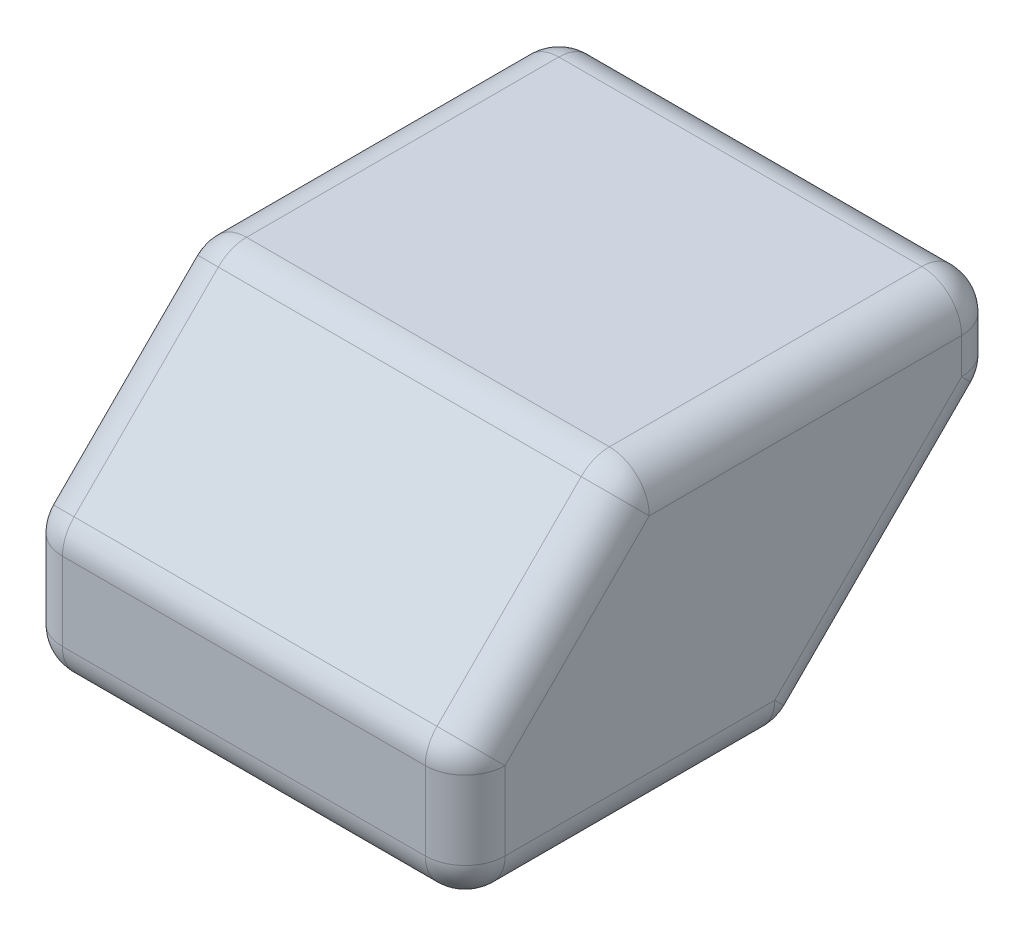
ISO-10303-21;
HEADER;
FILE_DESCRIPTION(('STEP AP214'),'2;1');
FILE_NAME('part.step','',(''),(''),'','','');
FILE_SCHEMA(('AUTOMOTIVE_DESIGN { 1 0 10303 214 1 1 1 1 }'));
ENDSEC;
DATA;
#1=APPLICATION_CONTEXT('core data for automotive mechanical design processes');
#2=APPLICATION_PROTOCOL_DEFINITION('international standard','automotive_design',2000,#1);
#3=PRODUCT_CONTEXT('',#1,'mechanical');
#4=PRODUCT('Part','Part','',(#3));
#5=PRODUCT_RELATED_PRODUCT_CATEGORY('part','',(#4));
#6=PRODUCT_DEFINITION_FORMATION('','',#4);
#7=PRODUCT_DEFINITION_CONTEXT('part definition',#1,'design');
#8=PRODUCT_DEFINITION('design','',#6,#7);
#9=PRODUCT_DEFINITION_SHAPE('','',#8);
#10=(LENGTH_UNIT() NAMED_UNIT(*) SI_UNIT(.MILLI.,.METRE.));
#11=(NAMED_UNIT(*) PLANE_ANGLE_UNIT() SI_UNIT($,.RADIAN.));
#12=(NAMED_UNIT(*) SI_UNIT($,.STERADIAN.) SOLID_ANGLE_UNIT());
#13=UNCERTAINTY_MEASURE_WITH_UNIT(LENGTH_MEASURE(1.E-05),#10,'distance_accuracy_value','');
#14=(GEOMETRIC_REPRESENTATION_CONTEXT(3) GLOBAL_UNCERTAINTY_ASSIGNED_CONTEXT((#13)) GLOBAL_UNIT_ASSIGNED_CONTEXT((#10,
#11,#12)) REPRESENTATION_CONTEXT('',''));
#15=CARTESIAN_POINT('',(0.,0.,0.));
#16=DIRECTION('',(0.,0.,1.));
#17=DIRECTION('',(1.,0.,0.));
#18=AXIS2_PLACEMENT_3D('',#15,#16,#17);
#19=CARTESIAN_POINT('',(0.,18.034,0.));
#20=DIRECTION('',(1.,0.,0.));
#21=DIRECTION('',(0.,0.,-1.));
#22=AXIS2_PLACEMENT_3D('',#19,#20,#21);
#23=PLANE('',#22);
#24=DIRECTION('',(0.,0.,1.));
#25=VECTOR('',#24,1.);
#26=CARTESIAN_POINT('',(0.,15.654,0.));
#27=LINE('',#26,#25);
#28=CARTESIAN_POINT('',(0.,15.654,-10.985828278448));
#29=VERTEX_POINT('',#28);
#30=CARTESIAN_POINT('',(0.,15.654,-29.624));
#31=VERTEX_POINT('',#30);
#32=EDGE_CURVE('E204',#29,#31,#27,.F.);
#33=ORIENTED_EDGE('',*,*,#32,.T.);
#34=DIRECTION('',(0.,-1.,0.));
#35=VECTOR('',#34,1.);
#36=CARTESIAN_POINT('',(0.,18.034,-29.624));
#37=LINE('',#36,#35);
#38=CARTESIAN_POINT('',(0.,13.525828278448,-29.624));
#39=VERTEX_POINT('',#38);
#40=EDGE_CURVE('E166',#31,#39,#37,.T.);
#41=ORIENTED_EDGE('',*,*,#40,.T.);
#42=DIRECTION('',(0.,-0.707106781186546,0.707106781186549));
#43=VECTOR('',#42,1.);
#44=CARTESIAN_POINT('',(0.,1.68291413922399,-17.781085860776));
#45=LINE('',#44,#43);
#46=CARTESIAN_POINT('',(0.,2.38,-18.478171721552));
#47=VERTEX_POINT('',#46);
#48=EDGE_CURVE('E160',#39,#47,#45,.T.);
#49=ORIENTED_EDGE('',*,*,#48,.T.);
#50=DIRECTION('',(0.,0.,1.));
#51=VECTOR('',#50,1.);
#52=CARTESIAN_POINT('',(0.,2.38,0.));
#53=LINE('',#52,#51);
#54=CARTESIAN_POINT('',(0.,2.38,-2.38));
#55=VERTEX_POINT('',#54);
#56=EDGE_CURVE('E163',#47,#55,#53,.T.);
#57=ORIENTED_EDGE('',*,*,#56,.T.);
#58=DIRECTION('',(0.,-1.,0.));
#59=VECTOR('',#58,1.);
#60=CARTESIAN_POINT('',(0.,18.034,-2.38));
#61=LINE('',#60,#59);
#62=CARTESIAN_POINT('',(0.,7.04817172155201,-2.38));
#63=VERTEX_POINT('',#62);
#64=EDGE_CURVE('E171',#55,#63,#61,.F.);
#65=ORIENTED_EDGE('',*,*,#64,.T.);
#66=DIRECTION('',(0.,-0.707106781186549,0.707106781186546));
#67=VECTOR('',#66,1.);
#68=CARTESIAN_POINT('',(0.,16.351085860776,-11.682914139224));
#69=LINE('',#68,#67);
#70=EDGE_CURVE('E170',#63,#29,#69,.F.);
#71=ORIENTED_EDGE('',*,*,#70,.T.);
#72=EDGE_LOOP('',(#33,#41,#49,#57,#65,#71));
#73=FACE_BOUND('',#72,.T.);
#74=ADVANCED_FACE('F34',(#73),#23,.F.);
#75=CARTESIAN_POINT('',(0.,18.034,0.));
#76=DIRECTION('',(0.,0.,-1.));
#77=DIRECTION('',(-1.,0.,0.));
#78=AXIS2_PLACEMENT_3D('',#75,#76,#77);
#79=PLANE('',#78);
#80=DIRECTION('',(0.,-1.,0.));
#81=VECTOR('',#80,1.);
#82=CARTESIAN_POINT('',(24.036,18.034,0.));
#83=LINE('',#82,#81);
#84=CARTESIAN_POINT('',(24.036,2.38,0.));
#85=VERTEX_POINT('',#84);
#86=CARTESIAN_POINT('',(24.036,7.04817172155201,0.));
#87=VERTEX_POINT('',#86);
#88=EDGE_CURVE('E218',#85,#87,#83,.F.);
#89=ORIENTED_EDGE('',*,*,#88,.T.);
#90=DIRECTION('',(1.,0.,0.));
#91=VECTOR('',#90,1.);
#92=CARTESIAN_POINT('',(0.,7.04817172155201,0.));
#93=LINE('',#92,#91);
#94=CARTESIAN_POINT('',(2.38,7.04817172155201,0.));
#95=VERTEX_POINT('',#94);
#96=EDGE_CURVE('E222',#87,#95,#93,.F.);
#97=ORIENTED_EDGE('',*,*,#96,.T.);
#98=DIRECTION('',(0.,-1.,0.));
#99=VECTOR('',#98,1.);
#100=CARTESIAN_POINT('',(2.38,18.034,0.));
#101=LINE('',#100,#99);
#102=CARTESIAN_POINT('',(2.38,2.38,0.));
#103=VERTEX_POINT('',#102);
#104=EDGE_CURVE('E220',#95,#103,#101,.T.);
#105=ORIENTED_EDGE('',*,*,#104,.T.);
#106=DIRECTION('',(1.,0.,0.));
#107=VECTOR('',#106,1.);
#108=CARTESIAN_POINT('',(26.416,2.38,0.));
#109=LINE('',#108,#107);
#110=EDGE_CURVE('E216',#103,#85,#109,.T.);
#111=ORIENTED_EDGE('',*,*,#110,.T.);
#112=EDGE_LOOP('',(#89,#97,#105,#111));
#113=FACE_BOUND('',#112,.T.);
#114=ADVANCED_FACE('F435',(#113),#79,.F.);
#115=CARTESIAN_POINT('',(26.416,18.034,0.));
#116=DIRECTION('',(-1.,0.,0.));
#117=DIRECTION('',(0.,0.,1.));
#118=AXIS2_PLACEMENT_3D('',#115,#116,#117);
#119=PLANE('',#118);
#120=DIRECTION('',(0.,0.707106781186546,-0.707106781186549));
#121=VECTOR('',#120,1.);
#122=CARTESIAN_POINT('',(26.416,14.222914139224,-30.321085860776));
#123=LINE('',#122,#121);
#124=CARTESIAN_POINT('',(26.416,2.38,-18.478171721552));
#125=VERTEX_POINT('',#124);
#126=CARTESIAN_POINT('',(26.416,13.525828278448,-29.624));
#127=VERTEX_POINT('',#126);
#128=EDGE_CURVE('E229',#125,#127,#123,.T.);
#129=ORIENTED_EDGE('',*,*,#128,.T.);
#130=DIRECTION('',(0.,-1.,0.));
#131=VECTOR('',#130,1.);
#132=CARTESIAN_POINT('',(26.416,18.034,-29.624));
#133=LINE('',#132,#131);
#134=CARTESIAN_POINT('',(26.416,15.654,-29.624));
#135=VERTEX_POINT('',#134);
#136=EDGE_CURVE('E236',#127,#135,#133,.F.);
#137=ORIENTED_EDGE('',*,*,#136,.T.);
#138=DIRECTION('',(0.,0.,-1.));
#139=VECTOR('',#138,1.);
#140=CARTESIAN_POINT('',(26.416,15.654,0.));
#141=LINE('',#140,#139);
#142=CARTESIAN_POINT('',(26.416,15.654,-10.985828278448));
#143=VERTEX_POINT('',#142);
#144=EDGE_CURVE('E234',#135,#143,#141,.F.);
#145=ORIENTED_EDGE('',*,*,#144,.T.);
#146=DIRECTION('',(0.,0.707106781186549,-0.707106781186546));
#147=VECTOR('',#146,1.);
#148=CARTESIAN_POINT('',(26.416,6.35108586077599,-1.68291413922399));
#149=LINE('',#148,#147);
#150=CARTESIAN_POINT('',(26.416,7.04817172155201,-2.38));
#151=VERTEX_POINT('',#150);
#152=EDGE_CURVE('E231',#143,#151,#149,.F.);
#153=ORIENTED_EDGE('',*,*,#152,.T.);
#154=DIRECTION('',(0.,-1.,0.));
#155=VECTOR('',#154,1.);
#156=CARTESIAN_POINT('',(26.416,18.034,-2.38));
#157=LINE('',#156,#155);
#158=CARTESIAN_POINT('',(26.416,2.38,-2.38));
#159=VERTEX_POINT('',#158);
#160=EDGE_CURVE('E227',#151,#159,#157,.T.);
#161=ORIENTED_EDGE('',*,*,#160,.T.);
#162=DIRECTION('',(0.,0.,-1.));
#163=VECTOR('',#162,1.);
#164=CARTESIAN_POINT('',(26.416,2.38,-19.464));
#165=LINE('',#164,#163);
#166=EDGE_CURVE('E225',#159,#125,#165,.T.);
#167=ORIENTED_EDGE('',*,*,#166,.T.);
#168=EDGE_LOOP('',(#129,#137,#145,#153,#161,#167));
#169=FACE_BOUND('',#168,.T.);
#170=ADVANCED_FACE('F403',(#169),#119,.F.);
#171=CARTESIAN_POINT('',(0.,18.034,-32.004));
#172=DIRECTION('',(0.,0.,1.));
#173=DIRECTION('',(1.,0.,0.));
#174=AXIS2_PLACEMENT_3D('',#171,#172,#173);
#175=PLANE('',#174);
#176=DIRECTION('',(0.,-1.,0.));
#177=VECTOR('',#176,1.);
#178=CARTESIAN_POINT('',(24.036,18.034,-32.004));
#179=LINE('',#178,#177);
#180=CARTESIAN_POINT('',(24.036,15.654,-32.004));
#181=VERTEX_POINT('',#180);
#182=CARTESIAN_POINT('',(24.036,13.525828278448,-32.004));
#183=VERTEX_POINT('',#182);
#184=EDGE_CURVE('E43',#181,#183,#179,.T.);
#185=ORIENTED_EDGE('',*,*,#184,.T.);
#186=DIRECTION('',(-1.,0.,0.));
#187=VECTOR('',#186,1.);
#188=CARTESIAN_POINT('',(0.,13.525828278448,-32.004));
#189=LINE('',#188,#187);
#190=CARTESIAN_POINT('',(2.38,13.525828278448,-32.004));
#191=VERTEX_POINT('',#190);
#192=EDGE_CURVE('E11',#183,#191,#189,.T.);
#193=ORIENTED_EDGE('',*,*,#192,.T.);
#194=DIRECTION('',(0.,-1.,0.));
#195=VECTOR('',#194,1.);
#196=CARTESIAN_POINT('',(2.38,18.034,-32.004));
#197=LINE('',#196,#195);
#198=CARTESIAN_POINT('',(2.38,15.654,-32.004));
#199=VERTEX_POINT('',#198);
#200=EDGE_CURVE('E57',#191,#199,#197,.F.);
#201=ORIENTED_EDGE('',*,*,#200,.T.);
#202=DIRECTION('',(-1.,0.,0.));
#203=VECTOR('',#202,1.);
#204=CARTESIAN_POINT('',(0.,15.654,-32.004));
#205=LINE('',#204,#203);
#206=EDGE_CURVE('E264',#199,#181,#205,.F.);
#207=ORIENTED_EDGE('',*,*,#206,.T.);
#208=EDGE_LOOP('',(#185,#193,#201,#207));
#209=FACE_BOUND('',#208,.T.);
#210=ADVANCED_FACE('F363',(#209),#175,.F.);
#211=CARTESIAN_POINT('',(0.,18.034,0.));
#212=DIRECTION('',(0.,-1.,0.));
#213=DIRECTION('',(0.,0.,-1.));
#214=AXIS2_PLACEMENT_3D('',#211,#212,#213);
#215=PLANE('',#214);
#216=DIRECTION('',(-1.,0.,0.));
#217=VECTOR('',#216,1.);
#218=CARTESIAN_POINT('',(26.416,18.034,-10.985828278448));
#219=LINE('',#218,#217);
#220=CARTESIAN_POINT('',(2.38,18.034,-10.985828278448));
#221=VERTEX_POINT('',#220);
#222=CARTESIAN_POINT('',(24.036,18.034,-10.985828278448));
#223=VERTEX_POINT('',#222);
#224=EDGE_CURVE('E242',#221,#223,#219,.F.);
#225=ORIENTED_EDGE('',*,*,#224,.T.);
#226=DIRECTION('',(0.,0.,-1.));
#227=VECTOR('',#226,1.);
#228=CARTESIAN_POINT('',(24.036,18.034,0.));
#229=LINE('',#228,#227);
#230=CARTESIAN_POINT('',(24.036,18.034,-29.624));
#231=VERTEX_POINT('',#230);
#232=EDGE_CURVE('E245',#223,#231,#229,.T.);
#233=ORIENTED_EDGE('',*,*,#232,.T.);
#234=DIRECTION('',(-1.,0.,0.));
#235=VECTOR('',#234,1.);
#236=CARTESIAN_POINT('',(0.,18.034,-29.624));
#237=LINE('',#236,#235);
#238=CARTESIAN_POINT('',(2.38,18.034,-29.624));
#239=VERTEX_POINT('',#238);
#240=EDGE_CURVE('E240',#231,#239,#237,.T.);
#241=ORIENTED_EDGE('',*,*,#240,.T.);
#242=DIRECTION('',(0.,0.,1.));
#243=VECTOR('',#242,1.);
#244=CARTESIAN_POINT('',(2.38,18.034,0.));
#245=LINE('',#244,#243);
#246=EDGE_CURVE('E238',#239,#221,#245,.T.);
#247=ORIENTED_EDGE('',*,*,#246,.T.);
#248=EDGE_LOOP('',(#225,#233,#241,#247));
#249=FACE_BOUND('',#248,.T.);
#250=ADVANCED_FACE('F381',(#249),#215,.F.);
#251=CARTESIAN_POINT('',(0.,0.,0.));
#252=DIRECTION('',(0.,-1.,0.));
#253=DIRECTION('',(0.,0.,-1.));
#254=AXIS2_PLACEMENT_3D('',#251,#252,#253);
#255=PLANE('',#254);
#256=DIRECTION('',(0.,0.,1.));
#257=VECTOR('',#256,1.);
#258=CARTESIAN_POINT('',(2.38,0.,-19.464));
#259=LINE('',#258,#257);
#260=CARTESIAN_POINT('',(2.38,0.,-2.38));
#261=VERTEX_POINT('',#260);
#262=CARTESIAN_POINT('',(2.38,0.,-18.478171721552));
#263=VERTEX_POINT('',#262);
#264=EDGE_CURVE('E255',#261,#263,#259,.F.);
#265=ORIENTED_EDGE('',*,*,#264,.T.);
#266=DIRECTION('',(1.,0.,0.));
#267=VECTOR('',#266,1.);
#268=CARTESIAN_POINT('',(0.,0.,-18.478171721552));
#269=LINE('',#268,#267);
#270=CARTESIAN_POINT('',(24.036,0.,-18.478171721552));
#271=VERTEX_POINT('',#270);
#272=EDGE_CURVE('E261',#263,#271,#269,.T.);
#273=ORIENTED_EDGE('',*,*,#272,.T.);
#274=DIRECTION('',(0.,0.,-1.));
#275=VECTOR('',#274,1.);
#276=CARTESIAN_POINT('',(24.036,0.,0.));
#277=LINE('',#276,#275);
#278=CARTESIAN_POINT('',(24.036,0.,-2.38));
#279=VERTEX_POINT('',#278);
#280=EDGE_CURVE('E259',#271,#279,#277,.F.);
#281=ORIENTED_EDGE('',*,*,#280,.T.);
#282=DIRECTION('',(1.,0.,0.));
#283=VECTOR('',#282,1.);
#284=CARTESIAN_POINT('',(0.,0.,-2.38));
#285=LINE('',#284,#283);
#286=EDGE_CURVE('E257',#279,#261,#285,.F.);
#287=ORIENTED_EDGE('',*,*,#286,.T.);
#288=EDGE_LOOP('',(#265,#273,#281,#287));
#289=FACE_BOUND('',#288,.T.);
#290=ADVANCED_FACE('F416',(#289),#255,.T.);
#291=CARTESIAN_POINT('',(0.,12.54,-32.004));
#292=DIRECTION('',(0.,-0.707106781186549,-0.707106781186546));
#293=DIRECTION('',(1.,0.,0.));
#294=AXIS2_PLACEMENT_3D('',#291,#292,#293);
#295=PLANE('',#294);
#296=DIRECTION('',(-1.,0.,0.));
#297=VECTOR('',#296,1.);
#298=CARTESIAN_POINT('',(26.416,11.842914139224,-31.306914139224));
#299=LINE('',#298,#297);
#300=CARTESIAN_POINT('',(2.38,11.842914139224,-31.306914139224));
#301=VERTEX_POINT('',#300);
#302=CARTESIAN_POINT('',(24.036,11.842914139224,-31.306914139224));
#303=VERTEX_POINT('',#302);
#304=EDGE_CURVE('E247',#301,#303,#299,.F.);
#305=ORIENTED_EDGE('',*,*,#304,.T.);
#306=DIRECTION('',(0.,0.707106781186546,-0.707106781186549));
#307=VECTOR('',#306,1.);
#308=CARTESIAN_POINT('',(24.036,0.,-19.464));
#309=LINE('',#308,#307);
#310=CARTESIAN_POINT('',(24.036,0.697085860776012,-20.161085860776));
#311=VERTEX_POINT('',#310);
#312=EDGE_CURVE('E252',#303,#311,#309,.F.);
#313=ORIENTED_EDGE('',*,*,#312,.T.);
#314=DIRECTION('',(1.,0.,0.));
#315=VECTOR('',#314,1.);
#316=CARTESIAN_POINT('',(0.,0.697085860776011,-20.161085860776));
#317=LINE('',#316,#315);
#318=CARTESIAN_POINT('',(2.38,0.697085860776012,-20.161085860776));
#319=VERTEX_POINT('',#318);
#320=EDGE_CURVE('E250',#311,#319,#317,.F.);
#321=ORIENTED_EDGE('',*,*,#320,.T.);
#322=DIRECTION('',(0.,-0.707106781186546,0.707106781186549));
#323=VECTOR('',#322,1.);
#324=CARTESIAN_POINT('',(2.38,12.54,-32.004));
#325=LINE('',#324,#323);
#326=EDGE_CURVE('E178',#319,#301,#325,.F.);
#327=ORIENTED_EDGE('',*,*,#326,.T.);
#328=EDGE_LOOP('',(#305,#313,#321,#327));
#329=FACE_BOUND('',#328,.T.);
#330=ADVANCED_FACE('F422',(#329),#295,.T.);
#331=CARTESIAN_POINT('',(0.,18.034,-9.99999999999999));
#332=DIRECTION('',(0.,-0.707106781186546,-0.707106781186549));
#333=DIRECTION('',(1.,0.,0.));
#334=AXIS2_PLACEMENT_3D('',#331,#332,#333);
#335=PLANE('',#334);
#336=DIRECTION('',(1.,0.,0.));
#337=VECTOR('',#336,1.);
#338=CARTESIAN_POINT('',(0.,17.336914139224,-9.30291413922397));
#339=LINE('',#338,#337);
#340=CARTESIAN_POINT('',(24.036,17.336914139224,-9.30291413922397));
#341=VERTEX_POINT('',#340);
#342=CARTESIAN_POINT('',(2.38,17.336914139224,-9.30291413922397));
#343=VERTEX_POINT('',#342);
#344=EDGE_CURVE('E207',#341,#343,#339,.F.);
#345=ORIENTED_EDGE('',*,*,#344,.T.);
#346=DIRECTION('',(0.,0.707106781186549,-0.707106781186546));
#347=VECTOR('',#346,1.);
#348=CARTESIAN_POINT('',(2.38,8.03399999999998,0.));
#349=LINE('',#348,#347);
#350=CARTESIAN_POINT('',(2.38,8.73108586077599,-0.697085860776014));
#351=VERTEX_POINT('',#350);
#352=EDGE_CURVE('E213',#343,#351,#349,.F.);
#353=ORIENTED_EDGE('',*,*,#352,.T.);
#354=DIRECTION('',(-1.,0.,0.));
#355=VECTOR('',#354,1.);
#356=CARTESIAN_POINT('',(26.416,8.73108586077599,-0.697085860776013));
#357=LINE('',#356,#355);
#358=CARTESIAN_POINT('',(24.036,8.73108586077599,-0.697085860776014));
#359=VERTEX_POINT('',#358);
#360=EDGE_CURVE('E211',#351,#359,#357,.F.);
#361=ORIENTED_EDGE('',*,*,#360,.T.);
#362=DIRECTION('',(0.,-0.707106781186549,0.707106781186546));
#363=VECTOR('',#362,1.);
#364=CARTESIAN_POINT('',(24.036,18.034,-9.99999999999999));
#365=LINE('',#364,#363);
#366=EDGE_CURVE('E209',#359,#341,#365,.F.);
#367=ORIENTED_EDGE('',*,*,#366,.T.);
#368=EDGE_LOOP('',(#345,#353,#361,#367));
#369=FACE_BOUND('',#368,.T.);
#370=ADVANCED_FACE('F424',(#369),#335,.F.);
#371=CARTESIAN_POINT('',(24.036,0.967914139223976,-17.066085860776));
#372=DIRECTION('',(0.,-0.707106781186546,0.707106781186549));
#373=DIRECTION('',(0.,-0.707106781186549,-0.707106781186546));
#374=AXIS2_PLACEMENT_3D('',#371,#372,#373);
#375=CYLINDRICAL_SURFACE('',#374,2.38);
#376=CARTESIAN_POINT('',(24.036,2.38,-18.478171721552));
#377=DIRECTION('',(0.,-0.707106781186547,0.707106781186548));
#378=DIRECTION('',(0.,-0.707106781186548,-0.707106781186547));
#379=AXIS2_PLACEMENT_3D('',#376,#377,#378);
#380=CIRCLE('',#379,2.38);
#381=EDGE_CURVE('E38',#311,#125,#380,.T.);
#382=ORIENTED_EDGE('',*,*,#381,.F.);
#383=ORIENTED_EDGE('',*,*,#312,.F.);
#384=CARTESIAN_POINT('',(24.036,13.525828278448,-29.624));
#385=DIRECTION('',(0.,0.707106781186546,-0.707106781186549));
#386=DIRECTION('',(0.,0.707106781186549,0.707106781186546));
#387=AXIS2_PLACEMENT_3D('',#384,#385,#386);
#388=CIRCLE('',#387,2.38);
#389=EDGE_CURVE('E200',#127,#303,#388,.T.);
#390=ORIENTED_EDGE('',*,*,#389,.F.);
#391=ORIENTED_EDGE('',*,*,#128,.F.);
#392=EDGE_LOOP('',(#382,#383,#390,#391));
#393=FACE_BOUND('',#392,.T.);
#394=ADVANCED_FACE('F36',(#393),#375,.T.);
#395=CARTESIAN_POINT('',(24.036,2.38,-18.478171721552));
#396=DIRECTION('',(0.,0.,1.));
#397=DIRECTION('',(1.,0.,0.));
#398=AXIS2_PLACEMENT_3D('',#395,#396,#397);
#399=SPHERICAL_SURFACE('',#398,2.38);
#400=CARTESIAN_POINT('',(24.036,2.38,-18.478171721552));
#401=DIRECTION('',(1.,0.,0.));
#402=DIRECTION('',(0.,0.,-1.));
#403=AXIS2_PLACEMENT_3D('',#400,#401,#402);
#404=CIRCLE('',#403,2.38);
#405=EDGE_CURVE('E343',#311,#271,#404,.F.);
#406=ORIENTED_EDGE('',*,*,#405,.F.);
#407=ORIENTED_EDGE('',*,*,#381,.T.);
#408=CARTESIAN_POINT('',(24.036,2.38,-18.478171721552));
#409=DIRECTION('',(0.,0.,-1.));
#410=DIRECTION('',(0.,1.,0.));
#411=AXIS2_PLACEMENT_3D('',#408,#409,#410);
#412=CIRCLE('',#411,2.38);
#413=EDGE_CURVE('E346',#271,#125,#412,.F.);
#414=ORIENTED_EDGE('',*,*,#413,.F.);
#415=EDGE_LOOP('',(#406,#407,#414));
#416=FACE_BOUND('',#415,.T.);
#417=ADVANCED_FACE('F410',(#416),#399,.T.);
#418=CARTESIAN_POINT('',(24.036,13.525828278448,-29.624));
#419=DIRECTION('',(0.,0.,1.));
#420=DIRECTION('',(1.,0.,0.));
#421=AXIS2_PLACEMENT_3D('',#418,#419,#420);
#422=SPHERICAL_SURFACE('',#421,2.38);
#423=CARTESIAN_POINT('',(24.036,13.525828278448,-29.624));
#424=DIRECTION('',(0.,-1.,0.));
#425=DIRECTION('',(1.,0.,0.));
#426=AXIS2_PLACEMENT_3D('',#423,#424,#425);
#427=CIRCLE('',#426,2.38);
#428=EDGE_CURVE('E338',#127,#183,#427,.F.);
#429=ORIENTED_EDGE('',*,*,#428,.F.);
#430=ORIENTED_EDGE('',*,*,#389,.T.);
#431=CARTESIAN_POINT('',(24.036,13.525828278448,-29.624));
#432=DIRECTION('',(1.,0.,0.));
#433=DIRECTION('',(0.,0.,-1.));
#434=AXIS2_PLACEMENT_3D('',#431,#432,#433);
#435=CIRCLE('',#434,2.38);
#436=EDGE_CURVE('E340',#183,#303,#435,.F.);
#437=ORIENTED_EDGE('',*,*,#436,.F.);
#438=EDGE_LOOP('',(#429,#430,#437));
#439=FACE_BOUND('',#438,.T.);
#440=ADVANCED_FACE('F353',(#439),#422,.T.);
#441=CARTESIAN_POINT('',(24.036,2.38,0.));
#442=DIRECTION('',(0.,0.,1.));
#443=DIRECTION('',(1.,0.,0.));
#444=AXIS2_PLACEMENT_3D('',#441,#442,#443);
#445=CYLINDRICAL_SURFACE('',#444,2.38);
#446=ORIENTED_EDGE('',*,*,#413,.T.);
#447=ORIENTED_EDGE('',*,*,#166,.F.);
#448=CARTESIAN_POINT('',(24.036,2.38,-2.38));
#449=DIRECTION('',(0.,0.,1.));
#450=DIRECTION('',(1.,0.,0.));
#451=AXIS2_PLACEMENT_3D('',#448,#449,#450);
#452=CIRCLE('',#451,2.38);
#453=EDGE_CURVE('E335',#279,#159,#452,.T.);
#454=ORIENTED_EDGE('',*,*,#453,.F.);
#455=ORIENTED_EDGE('',*,*,#280,.F.);
#456=EDGE_LOOP('',(#446,#447,#454,#455));
#457=FACE_BOUND('',#456,.T.);
#458=ADVANCED_FACE('F412',(#457),#445,.T.);
#459=CARTESIAN_POINT('',(0.,2.38,-18.478171721552));
#460=DIRECTION('',(1.,0.,0.));
#461=DIRECTION('',(0.,0.,-1.));
#462=AXIS2_PLACEMENT_3D('',#459,#460,#461);
#463=CYLINDRICAL_SURFACE('',#462,2.38);
#464=ORIENTED_EDGE('',*,*,#405,.T.);
#465=ORIENTED_EDGE('',*,*,#272,.F.);
#466=CARTESIAN_POINT('',(2.38,2.38,-18.478171721552));
#467=DIRECTION('',(-1.,0.,0.));
#468=DIRECTION('',(0.,0.,1.));
#469=AXIS2_PLACEMENT_3D('',#466,#467,#468);
#470=CIRCLE('',#469,2.38);
#471=EDGE_CURVE('E182',#319,#263,#470,.T.);
#472=ORIENTED_EDGE('',*,*,#471,.F.);
#473=ORIENTED_EDGE('',*,*,#320,.F.);
#474=EDGE_LOOP('',(#464,#465,#472,#473));
#475=FACE_BOUND('',#474,.T.);
#476=ADVANCED_FACE('F420',(#475),#463,.T.);
#477=CARTESIAN_POINT('',(2.38,0.967914139223976,-17.066085860776));
#478=DIRECTION('',(0.,0.707106781186546,-0.707106781186549));
#479=DIRECTION('',(0.,0.707106781186549,0.707106781186546));
#480=AXIS2_PLACEMENT_3D('',#477,#478,#479);
#481=CYLINDRICAL_SURFACE('',#480,2.38);
#482=CARTESIAN_POINT('',(2.38,13.525828278448,-29.624));
#483=DIRECTION('',(0.,0.707106781186546,-0.707106781186549));
#484=DIRECTION('',(0.,0.707106781186549,0.707106781186546));
#485=AXIS2_PLACEMENT_3D('',#482,#483,#484);
#486=CIRCLE('',#485,2.38);
#487=EDGE_CURVE('E183',#301,#39,#486,.T.);
#488=ORIENTED_EDGE('',*,*,#487,.F.);
#489=ORIENTED_EDGE('',*,*,#326,.F.);
#490=CARTESIAN_POINT('',(2.38,2.38,-18.478171721552));
#491=DIRECTION('',(0.,-0.707106781186545,0.70710678118655));
#492=DIRECTION('',(0.,-0.70710678118655,-0.707106781186545));
#493=AXIS2_PLACEMENT_3D('',#490,#491,#492);
#494=CIRCLE('',#493,2.38);
#495=EDGE_CURVE('E175',#47,#319,#494,.T.);
#496=ORIENTED_EDGE('',*,*,#495,.F.);
#497=ORIENTED_EDGE('',*,*,#48,.F.);
#498=EDGE_LOOP('',(#488,#489,#496,#497));
#499=FACE_BOUND('',#498,.T.);
#500=ADVANCED_FACE('F177',(#499),#481,.T.);
#501=CARTESIAN_POINT('',(0.,13.525828278448,-29.624));
#502=DIRECTION('',(1.,0.,0.));
#503=DIRECTION('',(0.,0.,-1.));
#504=AXIS2_PLACEMENT_3D('',#501,#502,#503);
#505=CYLINDRICAL_SURFACE('',#504,2.38);
#506=ORIENTED_EDGE('',*,*,#436,.T.);
#507=ORIENTED_EDGE('',*,*,#304,.F.);
#508=CARTESIAN_POINT('',(2.38,13.525828278448,-29.624));
#509=DIRECTION('',(-1.,0.,0.));
#510=DIRECTION('',(0.,0.,1.));
#511=AXIS2_PLACEMENT_3D('',#508,#509,#510);
#512=CIRCLE('',#511,2.38);
#513=EDGE_CURVE('E330',#191,#301,#512,.T.);
#514=ORIENTED_EDGE('',*,*,#513,.F.);
#515=ORIENTED_EDGE('',*,*,#192,.F.);
#516=EDGE_LOOP('',(#506,#507,#514,#515));
#517=FACE_BOUND('',#516,.T.);
#518=ADVANCED_FACE('F361',(#517),#505,.T.);
#519=CARTESIAN_POINT('',(24.036,18.034,-29.624));
#520=DIRECTION('',(0.,-1.,0.));
#521=DIRECTION('',(0.,0.,-1.));
#522=AXIS2_PLACEMENT_3D('',#519,#520,#521);
#523=CYLINDRICAL_SURFACE('',#522,2.38);
#524=ORIENTED_EDGE('',*,*,#428,.T.);
#525=ORIENTED_EDGE('',*,*,#184,.F.);
#526=CARTESIAN_POINT('',(24.036,15.654,-29.624));
#527=DIRECTION('',(0.,1.,0.));
#528=DIRECTION('',(0.,0.,1.));
#529=AXIS2_PLACEMENT_3D('',#526,#527,#528);
#530=CIRCLE('',#529,2.38);
#531=EDGE_CURVE('E327',#135,#181,#530,.T.);
#532=ORIENTED_EDGE('',*,*,#531,.F.);
#533=ORIENTED_EDGE('',*,*,#136,.F.);
#534=EDGE_LOOP('',(#524,#525,#532,#533));
#535=FACE_BOUND('',#534,.T.);
#536=ADVANCED_FACE('F401',(#535),#523,.T.);
#537=CARTESIAN_POINT('',(24.036,2.38,-2.38));
#538=DIRECTION('',(0.,0.,1.));
#539=DIRECTION('',(1.,0.,0.));
#540=AXIS2_PLACEMENT_3D('',#537,#538,#539);
#541=SPHERICAL_SURFACE('',#540,2.38);
#542=CARTESIAN_POINT('',(24.036,2.38,-2.38));
#543=DIRECTION('',(1.,0.,0.));
#544=DIRECTION('',(0.,0.,-1.));
#545=AXIS2_PLACEMENT_3D('',#542,#543,#544);
#546=CIRCLE('',#545,2.38);
#547=EDGE_CURVE('E190',#279,#85,#546,.F.);
#548=ORIENTED_EDGE('',*,*,#547,.F.);
#549=ORIENTED_EDGE('',*,*,#453,.T.);
#550=CARTESIAN_POINT('',(24.036,2.38,-2.38));
#551=DIRECTION('',(0.,-1.,0.));
#552=DIRECTION('',(0.,0.,-1.));
#553=AXIS2_PLACEMENT_3D('',#550,#551,#552);
#554=CIRCLE('',#553,2.38);
#555=EDGE_CURVE('E324',#85,#159,#554,.F.);
#556=ORIENTED_EDGE('',*,*,#555,.F.);
#557=EDGE_LOOP('',(#548,#549,#556));
#558=FACE_BOUND('',#557,.T.);
#559=ADVANCED_FACE('F528',(#558),#541,.T.);
#560=CARTESIAN_POINT('',(2.38,2.38,-18.478171721552));
#561=DIRECTION('',(0.,0.,1.));
#562=DIRECTION('',(1.,0.,0.));
#563=AXIS2_PLACEMENT_3D('',#560,#561,#562);
#564=SPHERICAL_SURFACE('',#563,2.38);
#565=ORIENTED_EDGE('',*,*,#495,.T.);
#566=ORIENTED_EDGE('',*,*,#471,.T.);
#567=CARTESIAN_POINT('',(2.38,2.38,-18.478171721552));
#568=DIRECTION('',(0.,0.,-1.));
#569=DIRECTION('',(-1.,0.,0.));
#570=AXIS2_PLACEMENT_3D('',#567,#568,#569);
#571=CIRCLE('',#570,2.38);
#572=EDGE_CURVE('E186',#47,#263,#571,.F.);
#573=ORIENTED_EDGE('',*,*,#572,.F.);
#574=EDGE_LOOP('',(#565,#566,#573));
#575=FACE_BOUND('',#574,.T.);
#576=ADVANCED_FACE('F187',(#575),#564,.T.);
#577=CARTESIAN_POINT('',(2.38,13.525828278448,-29.624));
#578=DIRECTION('',(0.,0.,1.));
#579=DIRECTION('',(1.,0.,0.));
#580=AXIS2_PLACEMENT_3D('',#577,#578,#579);
#581=SPHERICAL_SURFACE('',#580,2.38);
#582=ORIENTED_EDGE('',*,*,#513,.T.);
#583=ORIENTED_EDGE('',*,*,#487,.T.);
#584=CARTESIAN_POINT('',(2.38,13.525828278448,-29.624));
#585=DIRECTION('',(0.,-1.,0.));
#586=DIRECTION('',(0.,0.,-1.));
#587=AXIS2_PLACEMENT_3D('',#584,#585,#586);
#588=CIRCLE('',#587,2.38);
#589=EDGE_CURVE('E191',#191,#39,#588,.F.);
#590=ORIENTED_EDGE('',*,*,#589,.F.);
#591=EDGE_LOOP('',(#582,#583,#590));
#592=FACE_BOUND('',#591,.T.);
#593=ADVANCED_FACE('F546',(#592),#581,.T.);
#594=CARTESIAN_POINT('',(24.036,15.654,-29.624));
#595=DIRECTION('',(0.,0.,1.));
#596=DIRECTION('',(1.,0.,0.));
#597=AXIS2_PLACEMENT_3D('',#594,#595,#596);
#598=SPHERICAL_SURFACE('',#597,2.38);
#599=CARTESIAN_POINT('',(24.036,15.654,-29.624));
#600=DIRECTION('',(0.,0.,-1.));
#601=DIRECTION('',(-1.,0.,0.));
#602=AXIS2_PLACEMENT_3D('',#599,#600,#601);
#603=CIRCLE('',#602,2.38);
#604=EDGE_CURVE('E315',#135,#231,#603,.F.);
#605=ORIENTED_EDGE('',*,*,#604,.F.);
#606=ORIENTED_EDGE('',*,*,#531,.T.);
#607=CARTESIAN_POINT('',(24.036,15.654,-29.624));
#608=DIRECTION('',(1.,0.,0.));
#609=DIRECTION('',(0.,0.,-1.));
#610=AXIS2_PLACEMENT_3D('',#607,#608,#609);
#611=CIRCLE('',#610,2.38);
#612=EDGE_CURVE('E318',#231,#181,#611,.F.);
#613=ORIENTED_EDGE('',*,*,#612,.F.);
#614=EDGE_LOOP('',(#605,#606,#613));
#615=FACE_BOUND('',#614,.T.);
#616=ADVANCED_FACE('F398',(#615),#598,.T.);
#617=CARTESIAN_POINT('',(24.036,18.034,-2.38));
#618=DIRECTION('',(0.,-1.,0.));
#619=DIRECTION('',(0.,0.,-1.));
#620=AXIS2_PLACEMENT_3D('',#617,#618,#619);
#621=CYLINDRICAL_SURFACE('',#620,2.38);
#622=ORIENTED_EDGE('',*,*,#555,.T.);
#623=ORIENTED_EDGE('',*,*,#160,.F.);
#624=CARTESIAN_POINT('',(24.036,7.04817172155201,-2.38));
#625=DIRECTION('',(0.,1.,0.));
#626=DIRECTION('',(-1.,0.,0.));
#627=AXIS2_PLACEMENT_3D('',#624,#625,#626);
#628=CIRCLE('',#627,2.38);
#629=EDGE_CURVE('E310',#87,#151,#628,.T.);
#630=ORIENTED_EDGE('',*,*,#629,.F.);
#631=ORIENTED_EDGE('',*,*,#88,.F.);
#632=EDGE_LOOP('',(#622,#623,#630,#631));
#633=FACE_BOUND('',#632,.T.);
#634=ADVANCED_FACE('F564',(#633),#621,.T.);
#635=CARTESIAN_POINT('',(0.,2.38,-2.38));
#636=DIRECTION('',(-1.,0.,0.));
#637=DIRECTION('',(0.,0.,1.));
#638=AXIS2_PLACEMENT_3D('',#635,#636,#637);
#639=CYLINDRICAL_SURFACE('',#638,2.38);
#640=ORIENTED_EDGE('',*,*,#547,.T.);
#641=ORIENTED_EDGE('',*,*,#110,.F.);
#642=CARTESIAN_POINT('',(2.38,2.38,-2.38));
#643=DIRECTION('',(-1.,0.,0.));
#644=DIRECTION('',(0.,0.,1.));
#645=AXIS2_PLACEMENT_3D('',#642,#643,#644);
#646=CIRCLE('',#645,2.38);
#647=EDGE_CURVE('E307',#261,#103,#646,.T.);
#648=ORIENTED_EDGE('',*,*,#647,.F.);
#649=ORIENTED_EDGE('',*,*,#286,.F.);
#650=EDGE_LOOP('',(#640,#641,#648,#649));
#651=FACE_BOUND('',#650,.T.);
#652=ADVANCED_FACE('F573',(#651),#639,.T.);
#653=CARTESIAN_POINT('',(2.38,2.38,0.));
#654=DIRECTION('',(0.,0.,-1.));
#655=DIRECTION('',(-1.,0.,0.));
#656=AXIS2_PLACEMENT_3D('',#653,#654,#655);
#657=CYLINDRICAL_SURFACE('',#656,2.38);
#658=ORIENTED_EDGE('',*,*,#572,.T.);
#659=ORIENTED_EDGE('',*,*,#264,.F.);
#660=CARTESIAN_POINT('',(2.38,2.38,-2.38));
#661=DIRECTION('',(0.,0.,1.));
#662=DIRECTION('',(1.,0.,0.));
#663=AXIS2_PLACEMENT_3D('',#660,#661,#662);
#664=CIRCLE('',#663,2.38);
#665=EDGE_CURVE('E195',#55,#261,#664,.T.);
#666=ORIENTED_EDGE('',*,*,#665,.F.);
#667=ORIENTED_EDGE('',*,*,#56,.F.);
#668=EDGE_LOOP('',(#658,#659,#666,#667));
#669=FACE_BOUND('',#668,.T.);
#670=ADVANCED_FACE('F193',(#669),#657,.T.);
#671=CARTESIAN_POINT('',(2.38,18.034,-29.624));
#672=DIRECTION('',(0.,-1.,0.));
#673=DIRECTION('',(0.,0.,-1.));
#674=AXIS2_PLACEMENT_3D('',#671,#672,#673);
#675=CYLINDRICAL_SURFACE('',#674,2.38);
#676=ORIENTED_EDGE('',*,*,#589,.T.);
#677=ORIENTED_EDGE('',*,*,#40,.F.);
#678=CARTESIAN_POINT('',(2.38,15.654,-29.624));
#679=DIRECTION('',(0.,1.,0.));
#680=DIRECTION('',(0.,0.,1.));
#681=AXIS2_PLACEMENT_3D('',#678,#679,#680);
#682=CIRCLE('',#681,2.38);
#683=EDGE_CURVE('E303',#199,#31,#682,.T.);
#684=ORIENTED_EDGE('',*,*,#683,.F.);
#685=ORIENTED_EDGE('',*,*,#200,.F.);
#686=EDGE_LOOP('',(#676,#677,#684,#685));
#687=FACE_BOUND('',#686,.T.);
#688=ADVANCED_FACE('F371',(#687),#675,.T.);
#689=CARTESIAN_POINT('',(0.,15.654,-29.624));
#690=DIRECTION('',(-1.,0.,0.));
#691=DIRECTION('',(0.,0.,1.));
#692=AXIS2_PLACEMENT_3D('',#689,#690,#691);
#693=CYLINDRICAL_SURFACE('',#692,2.38);
#694=ORIENTED_EDGE('',*,*,#612,.T.);
#695=ORIENTED_EDGE('',*,*,#206,.F.);
#696=CARTESIAN_POINT('',(2.38,15.654,-29.624));
#697=DIRECTION('',(-1.,0.,0.));
#698=DIRECTION('',(0.,0.,1.));
#699=AXIS2_PLACEMENT_3D('',#696,#697,#698);
#700=CIRCLE('',#699,2.38);
#701=EDGE_CURVE('E300',#239,#199,#700,.T.);
#702=ORIENTED_EDGE('',*,*,#701,.F.);
#703=ORIENTED_EDGE('',*,*,#240,.F.);
#704=EDGE_LOOP('',(#694,#695,#702,#703));
#705=FACE_BOUND('',#704,.T.);
#706=ADVANCED_FACE('F367',(#705),#693,.T.);
#707=CARTESIAN_POINT('',(24.036,15.654,0.));
#708=DIRECTION('',(0.,0.,-1.));
#709=DIRECTION('',(-1.,0.,0.));
#710=AXIS2_PLACEMENT_3D('',#707,#708,#709);
#711=CYLINDRICAL_SURFACE('',#710,2.38);
#712=ORIENTED_EDGE('',*,*,#604,.T.);
#713=ORIENTED_EDGE('',*,*,#232,.F.);
#714=CARTESIAN_POINT('',(24.036,15.654,-10.985828278448));
#715=DIRECTION('',(0.,0.,1.));
#716=DIRECTION('',(0.,-1.,0.));
#717=AXIS2_PLACEMENT_3D('',#714,#715,#716);
#718=CIRCLE('',#717,2.38);
#719=EDGE_CURVE('E297',#143,#223,#718,.T.);
#720=ORIENTED_EDGE('',*,*,#719,.F.);
#721=ORIENTED_EDGE('',*,*,#144,.F.);
#722=EDGE_LOOP('',(#712,#713,#720,#721));
#723=FACE_BOUND('',#722,.T.);
#724=ADVANCED_FACE('F395',(#723),#711,.T.);
#725=CARTESIAN_POINT('',(24.036,11.351085860776,-6.682914139224));
#726=DIRECTION('',(0.,-0.707106781186549,0.707106781186546));
#727=DIRECTION('',(0.,-0.707106781186546,-0.707106781186549));
#728=AXIS2_PLACEMENT_3D('',#725,#726,#727);
#729=CYLINDRICAL_SURFACE('',#728,2.38);
#730=CARTESIAN_POINT('',(24.036,7.04817172155201,-2.38));
#731=DIRECTION('',(0.,-0.707106781186549,0.707106781186547));
#732=DIRECTION('',(0.,-0.707106781186547,-0.707106781186549));
#733=AXIS2_PLACEMENT_3D('',#730,#731,#732);
#734=CIRCLE('',#733,2.38);
#735=EDGE_CURVE('E312',#151,#359,#734,.T.);
#736=ORIENTED_EDGE('',*,*,#735,.F.);
#737=ORIENTED_EDGE('',*,*,#152,.F.);
#738=CARTESIAN_POINT('',(24.036,15.654,-10.985828278448));
#739=DIRECTION('',(0.,0.707106781186549,-0.707106781186546));
#740=DIRECTION('',(0.,0.707106781186546,0.707106781186549));
#741=AXIS2_PLACEMENT_3D('',#738,#739,#740);
#742=CIRCLE('',#741,2.38);
#743=EDGE_CURVE('E294',#341,#143,#742,.T.);
#744=ORIENTED_EDGE('',*,*,#743,.F.);
#745=ORIENTED_EDGE('',*,*,#366,.F.);
#746=EDGE_LOOP('',(#736,#737,#744,#745));
#747=FACE_BOUND('',#746,.T.);
#748=ADVANCED_FACE('F616',(#747),#729,.T.);
#749=CARTESIAN_POINT('',(24.036,7.04817172155201,-2.38));
#750=DIRECTION('',(0.,0.,1.));
#751=DIRECTION('',(1.,0.,0.));
#752=AXIS2_PLACEMENT_3D('',#749,#750,#751);
#753=SPHERICAL_SURFACE('',#752,2.38);
#754=ORIENTED_EDGE('',*,*,#629,.T.);
#755=ORIENTED_EDGE('',*,*,#735,.T.);
#756=CARTESIAN_POINT('',(24.036,7.04817172155201,-2.38));
#757=DIRECTION('',(1.,0.,0.));
#758=DIRECTION('',(0.,0.,-1.));
#759=AXIS2_PLACEMENT_3D('',#756,#757,#758);
#760=CIRCLE('',#759,2.38);
#761=EDGE_CURVE('E291',#87,#359,#760,.F.);
#762=ORIENTED_EDGE('',*,*,#761,.F.);
#763=EDGE_LOOP('',(#754,#755,#762));
#764=FACE_BOUND('',#763,.T.);
#765=ADVANCED_FACE('F625',(#764),#753,.T.);
#766=CARTESIAN_POINT('',(2.38,2.38,-2.38));
#767=DIRECTION('',(0.,0.,1.));
#768=DIRECTION('',(1.,0.,0.));
#769=AXIS2_PLACEMENT_3D('',#766,#767,#768);
#770=SPHERICAL_SURFACE('',#769,2.38);
#771=ORIENTED_EDGE('',*,*,#665,.T.);
#772=ORIENTED_EDGE('',*,*,#647,.T.);
#773=CARTESIAN_POINT('',(2.38,2.38,-2.38));
#774=DIRECTION('',(0.,-1.,0.));
#775=DIRECTION('',(0.,0.,-1.));
#776=AXIS2_PLACEMENT_3D('',#773,#774,#775);
#777=CIRCLE('',#776,2.38);
#778=EDGE_CURVE('E288',#55,#103,#777,.F.);
#779=ORIENTED_EDGE('',*,*,#778,.F.);
#780=EDGE_LOOP('',(#771,#772,#779));
#781=FACE_BOUND('',#780,.T.);
#782=ADVANCED_FACE('F635',(#781),#770,.T.);
#783=CARTESIAN_POINT('',(2.38,15.654,-29.624));
#784=DIRECTION('',(0.,0.,1.));
#785=DIRECTION('',(1.,0.,0.));
#786=AXIS2_PLACEMENT_3D('',#783,#784,#785);
#787=SPHERICAL_SURFACE('',#786,2.38);
#788=ORIENTED_EDGE('',*,*,#701,.T.);
#789=ORIENTED_EDGE('',*,*,#683,.T.);
#790=CARTESIAN_POINT('',(2.38,15.654,-29.624));
#791=DIRECTION('',(0.,0.,-1.));
#792=DIRECTION('',(-1.,0.,0.));
#793=AXIS2_PLACEMENT_3D('',#790,#791,#792);
#794=CIRCLE('',#793,2.38);
#795=EDGE_CURVE('E285',#239,#31,#794,.F.);
#796=ORIENTED_EDGE('',*,*,#795,.F.);
#797=EDGE_LOOP('',(#788,#789,#796));
#798=FACE_BOUND('',#797,.T.);
#799=ADVANCED_FACE('F373',(#798),#787,.T.);
#800=CARTESIAN_POINT('',(24.036,15.654,-10.985828278448));
#801=DIRECTION('',(0.,0.,1.));
#802=DIRECTION('',(1.,0.,0.));
#803=AXIS2_PLACEMENT_3D('',#800,#801,#802);
#804=SPHERICAL_SURFACE('',#803,2.38);
#805=ORIENTED_EDGE('',*,*,#743,.T.);
#806=ORIENTED_EDGE('',*,*,#719,.T.);
#807=CARTESIAN_POINT('',(24.036,15.654,-10.985828278448));
#808=DIRECTION('',(1.,0.,0.));
#809=DIRECTION('',(0.,0.,-1.));
#810=AXIS2_PLACEMENT_3D('',#807,#808,#809);
#811=CIRCLE('',#810,2.38);
#812=EDGE_CURVE('E283',#341,#223,#811,.F.);
#813=ORIENTED_EDGE('',*,*,#812,.F.);
#814=EDGE_LOOP('',(#805,#806,#813));
#815=FACE_BOUND('',#814,.T.);
#816=ADVANCED_FACE('F391',(#815),#804,.T.);
#817=CARTESIAN_POINT('',(0.,7.04817172155201,-2.38));
#818=DIRECTION('',(-1.,0.,0.));
#819=DIRECTION('',(0.,0.,1.));
#820=AXIS2_PLACEMENT_3D('',#817,#818,#819);
#821=CYLINDRICAL_SURFACE('',#820,2.38);
#822=ORIENTED_EDGE('',*,*,#761,.T.);
#823=ORIENTED_EDGE('',*,*,#360,.F.);
#824=CARTESIAN_POINT('',(2.38,7.04817172155201,-2.38));
#825=DIRECTION('',(-1.,0.,0.));
#826=DIRECTION('',(0.,0.,1.));
#827=AXIS2_PLACEMENT_3D('',#824,#825,#826);
#828=CIRCLE('',#827,2.38);
#829=EDGE_CURVE('E280',#95,#351,#828,.T.);
#830=ORIENTED_EDGE('',*,*,#829,.F.);
#831=ORIENTED_EDGE('',*,*,#96,.F.);
#832=EDGE_LOOP('',(#822,#823,#830,#831));
#833=FACE_BOUND('',#832,.T.);
#834=ADVANCED_FACE('F662',(#833),#821,.T.);
#835=CARTESIAN_POINT('',(2.38,18.034,-2.38));
#836=DIRECTION('',(0.,-1.,0.));
#837=DIRECTION('',(0.,0.,-1.));
#838=AXIS2_PLACEMENT_3D('',#835,#836,#837);
#839=CYLINDRICAL_SURFACE('',#838,2.38);
#840=ORIENTED_EDGE('',*,*,#778,.T.);
#841=ORIENTED_EDGE('',*,*,#104,.F.);
#842=CARTESIAN_POINT('',(2.38,7.04817172155201,-2.38));
#843=DIRECTION('',(0.,1.,0.));
#844=DIRECTION('',(0.,0.,1.));
#845=AXIS2_PLACEMENT_3D('',#842,#843,#844);
#846=CIRCLE('',#845,2.38);
#847=EDGE_CURVE('E278',#63,#95,#846,.T.);
#848=ORIENTED_EDGE('',*,*,#847,.F.);
#849=ORIENTED_EDGE('',*,*,#64,.F.);
#850=EDGE_LOOP('',(#840,#841,#848,#849));
#851=FACE_BOUND('',#850,.T.);
#852=ADVANCED_FACE('F671',(#851),#839,.T.);
#853=CARTESIAN_POINT('',(2.38,15.654,0.));
#854=DIRECTION('',(0.,0.,1.));
#855=DIRECTION('',(1.,0.,0.));
#856=AXIS2_PLACEMENT_3D('',#853,#854,#855);
#857=CYLINDRICAL_SURFACE('',#856,2.38);
#858=ORIENTED_EDGE('',*,*,#795,.T.);
#859=ORIENTED_EDGE('',*,*,#32,.F.);
#860=CARTESIAN_POINT('',(2.38,15.654,-10.985828278448));
#861=DIRECTION('',(0.,0.,1.));
#862=DIRECTION('',(1.,0.,0.));
#863=AXIS2_PLACEMENT_3D('',#860,#861,#862);
#864=CIRCLE('',#863,2.38);
#865=EDGE_CURVE('E275',#221,#29,#864,.T.);
#866=ORIENTED_EDGE('',*,*,#865,.F.);
#867=ORIENTED_EDGE('',*,*,#246,.F.);
#868=EDGE_LOOP('',(#858,#859,#866,#867));
#869=FACE_BOUND('',#868,.T.);
#870=ADVANCED_FACE('F378',(#869),#857,.T.);
#871=CARTESIAN_POINT('',(0.,15.654,-10.985828278448));
#872=DIRECTION('',(1.,0.,0.));
#873=DIRECTION('',(0.,0.,-1.));
#874=AXIS2_PLACEMENT_3D('',#871,#872,#873);
#875=CYLINDRICAL_SURFACE('',#874,2.38);
#876=ORIENTED_EDGE('',*,*,#812,.T.);
#877=ORIENTED_EDGE('',*,*,#224,.F.);
#878=CARTESIAN_POINT('',(2.38,15.654,-10.985828278448));
#879=DIRECTION('',(-1.,0.,0.));
#880=DIRECTION('',(0.,0.,1.));
#881=AXIS2_PLACEMENT_3D('',#878,#879,#880);
#882=CIRCLE('',#881,2.38);
#883=EDGE_CURVE('E272',#343,#221,#882,.T.);
#884=ORIENTED_EDGE('',*,*,#883,.F.);
#885=ORIENTED_EDGE('',*,*,#344,.F.);
#886=EDGE_LOOP('',(#876,#877,#884,#885));
#887=FACE_BOUND('',#886,.T.);
#888=ADVANCED_FACE('F384',(#887),#875,.T.);
#889=CARTESIAN_POINT('',(2.38,7.04817172155201,-2.38));
#890=DIRECTION('',(0.,0.,1.));
#891=DIRECTION('',(1.,0.,0.));
#892=AXIS2_PLACEMENT_3D('',#889,#890,#891);
#893=SPHERICAL_SURFACE('',#892,2.38);
#894=ORIENTED_EDGE('',*,*,#847,.T.);
#895=ORIENTED_EDGE('',*,*,#829,.T.);
#896=CARTESIAN_POINT('',(2.38,7.04817172155201,-2.38));
#897=DIRECTION('',(0.,-0.707106781186549,0.707106781186546));
#898=DIRECTION('',(0.,-0.707106781186546,-0.707106781186549));
#899=AXIS2_PLACEMENT_3D('',#896,#897,#898);
#900=CIRCLE('',#899,2.38);
#901=EDGE_CURVE('E270',#63,#351,#900,.F.);
#902=ORIENTED_EDGE('',*,*,#901,.F.);
#903=EDGE_LOOP('',(#894,#895,#902));
#904=FACE_BOUND('',#903,.T.);
#905=ADVANCED_FACE('F698',(#904),#893,.T.);
#906=CARTESIAN_POINT('',(2.38,15.654,-10.985828278448));
#907=DIRECTION('',(0.,0.,1.));
#908=DIRECTION('',(1.,0.,0.));
#909=AXIS2_PLACEMENT_3D('',#906,#907,#908);
#910=SPHERICAL_SURFACE('',#909,2.38);
#911=ORIENTED_EDGE('',*,*,#883,.T.);
#912=ORIENTED_EDGE('',*,*,#865,.T.);
#913=CARTESIAN_POINT('',(2.38,15.654,-10.985828278448));
#914=DIRECTION('',(0.,0.707106781186549,-0.707106781186546));
#915=DIRECTION('',(0.,0.707106781186546,0.707106781186549));
#916=AXIS2_PLACEMENT_3D('',#913,#914,#915);
#917=CIRCLE('',#916,2.38);
#918=EDGE_CURVE('E268',#343,#29,#917,.F.);
#919=ORIENTED_EDGE('',*,*,#918,.F.);
#920=EDGE_LOOP('',(#911,#912,#919));
#921=FACE_BOUND('',#920,.T.);
#922=ADVANCED_FACE('F707',(#921),#910,.T.);
#923=CARTESIAN_POINT('',(2.38,11.351085860776,-6.682914139224));
#924=DIRECTION('',(0.,0.707106781186549,-0.707106781186546));
#925=DIRECTION('',(0.,0.707106781186546,0.707106781186549));
#926=AXIS2_PLACEMENT_3D('',#923,#924,#925);
#927=CYLINDRICAL_SURFACE('',#926,2.38);
#928=ORIENTED_EDGE('',*,*,#901,.T.);
#929=ORIENTED_EDGE('',*,*,#352,.F.);
#930=ORIENTED_EDGE('',*,*,#918,.T.);
#931=ORIENTED_EDGE('',*,*,#70,.F.);
#932=EDGE_LOOP('',(#928,#929,#930,#931));
#933=FACE_BOUND('',#932,.T.);
#934=ADVANCED_FACE('F717',(#933),#927,.T.);
#935=CLOSED_SHELL('',(#74,#114,#170,#210,#250,#290,#330,#370,#394,#417,#440,#458,#476,#500,#518,
#536,#559,#576,#593,#616,#634,#652,#670,#688,#706,#724,#748,#765,#782,#799,#816,#834,#852,#870,
#888,#905,#922,#934));
#936=MANIFOLD_SOLID_BREP('B2',#935);
#937=ADVANCED_BREP_SHAPE_REPRESENTATION('',(#18,#936),#14);
#938=SHAPE_DEFINITION_REPRESENTATION(#9,#937);
ENDSEC;
END-ISO-10303-21;
